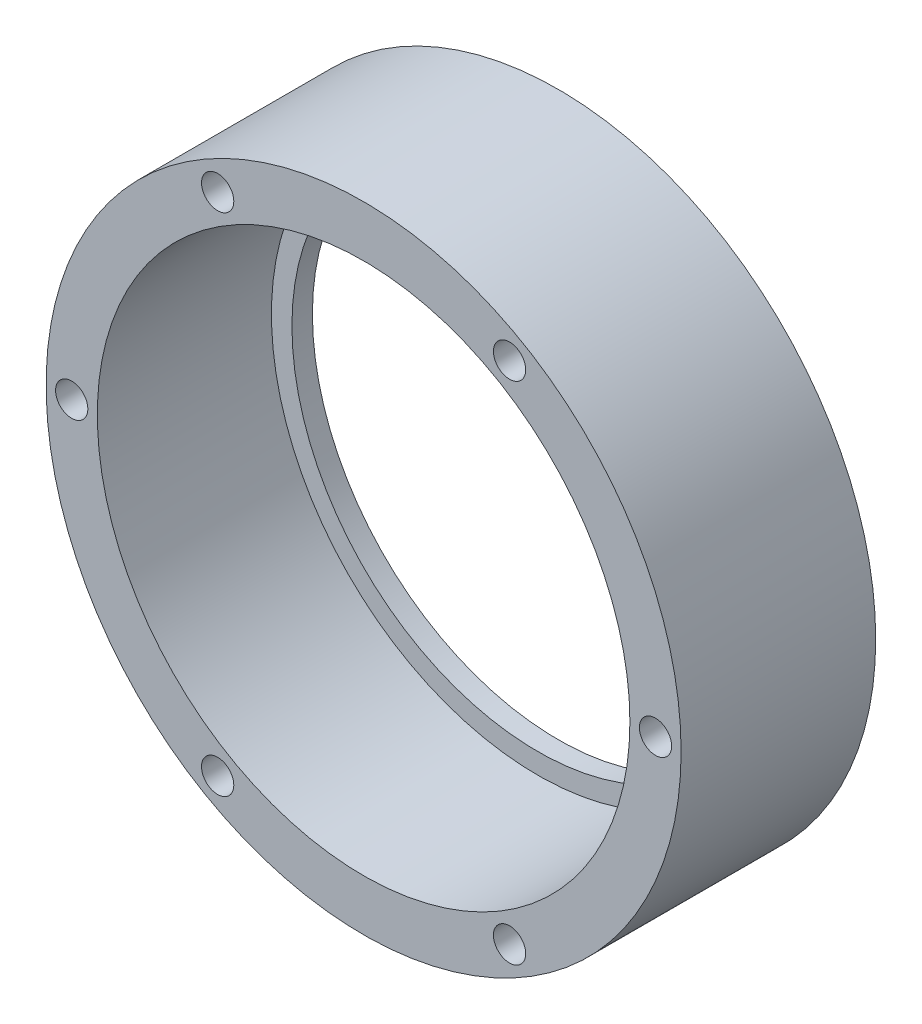
ISO-10303-21;
HEADER;
FILE_DESCRIPTION(('STEP AP214'),'2;1');
FILE_NAME('part.step','',(''),(''),'','','');
FILE_SCHEMA(('AUTOMOTIVE_DESIGN { 1 0 10303 214 1 1 1 1 }'));
ENDSEC;
DATA;
#1=APPLICATION_CONTEXT('core data for automotive mechanical design processes');
#2=APPLICATION_PROTOCOL_DEFINITION('international standard','automotive_design',2000,#1);
#3=PRODUCT_CONTEXT('',#1,'mechanical');
#4=PRODUCT('Part','Part','',(#3));
#5=PRODUCT_RELATED_PRODUCT_CATEGORY('part','',(#4));
#6=PRODUCT_DEFINITION_FORMATION('','',#4);
#7=PRODUCT_DEFINITION_CONTEXT('part definition',#1,'design');
#8=PRODUCT_DEFINITION('design','',#6,#7);
#9=PRODUCT_DEFINITION_SHAPE('','',#8);
#10=(LENGTH_UNIT() NAMED_UNIT(*) SI_UNIT(.MILLI.,.METRE.));
#11=(NAMED_UNIT(*) PLANE_ANGLE_UNIT() SI_UNIT($,.RADIAN.));
#12=(NAMED_UNIT(*) SI_UNIT($,.STERADIAN.) SOLID_ANGLE_UNIT());
#13=UNCERTAINTY_MEASURE_WITH_UNIT(LENGTH_MEASURE(1.E-05),#10,'distance_accuracy_value','');
#14=(GEOMETRIC_REPRESENTATION_CONTEXT(3) GLOBAL_UNCERTAINTY_ASSIGNED_CONTEXT((#13)) GLOBAL_UNIT_ASSIGNED_CONTEXT((#10,
#11,#12)) REPRESENTATION_CONTEXT('',''));
#15=CARTESIAN_POINT('',(0.,0.,0.));
#16=DIRECTION('',(0.,0.,1.));
#17=DIRECTION('',(1.,0.,0.));
#18=AXIS2_PLACEMENT_3D('',#15,#16,#17);
#19=CARTESIAN_POINT('',(0.,31.,-19.));
#20=DIRECTION('',(0.,0.,1.));
#21=DIRECTION('',(1.,0.,0.));
#22=AXIS2_PLACEMENT_3D('',#19,#20,#21);
#23=PLANE('',#22);
#24=CARTESIAN_POINT('',(0.,0.,-19.));
#25=DIRECTION('',(0.,0.,1.));
#26=DIRECTION('',(1.,0.,0.));
#27=AXIS2_PLACEMENT_3D('',#24,#25,#26);
#28=CIRCLE('',#27,31.);
#29=CARTESIAN_POINT('',(31.,0.,-19.));
#30=VERTEX_POINT('',#29);
#31=EDGE_CURVE('E106',#30,#30,#28,.T.);
#32=ORIENTED_EDGE('',*,*,#31,.F.);
#33=EDGE_LOOP('',(#32));
#34=FACE_BOUND('',#33,.T.);
#35=CARTESIAN_POINT('',(0.,0.,-19.));
#36=DIRECTION('',(0.,0.,1.));
#37=DIRECTION('',(1.,0.,0.));
#38=AXIS2_PLACEMENT_3D('',#35,#36,#37);
#39=CIRCLE('',#38,24.);
#40=CARTESIAN_POINT('',(24.,0.,-19.));
#41=VERTEX_POINT('',#40);
#42=EDGE_CURVE('E11',#41,#41,#39,.T.);
#43=ORIENTED_EDGE('',*,*,#42,.T.);
#44=EDGE_LOOP('',(#43));
#45=FACE_BOUND('',#44,.T.);
#46=ADVANCED_FACE('F35',(#34,#45),#23,.F.);
#47=CARTESIAN_POINT('',(0.,0.,0.));
#48=DIRECTION('',(0.,0.,1.));
#49=DIRECTION('',(1.,0.,0.));
#50=AXIS2_PLACEMENT_3D('',#47,#48,#49);
#51=CYLINDRICAL_SURFACE('',#50,24.);
#52=ORIENTED_EDGE('',*,*,#42,.F.);
#53=EDGE_LOOP('',(#52));
#54=FACE_BOUND('',#53,.T.);
#55=CARTESIAN_POINT('',(0.,0.,-17.));
#56=DIRECTION('',(0.,0.,1.));
#57=DIRECTION('',(1.,0.,0.));
#58=AXIS2_PLACEMENT_3D('',#55,#56,#57);
#59=CIRCLE('',#58,24.);
#60=CARTESIAN_POINT('',(24.,0.,-17.));
#61=VERTEX_POINT('',#60);
#62=EDGE_CURVE('E42',#61,#61,#59,.T.);
#63=ORIENTED_EDGE('',*,*,#62,.T.);
#64=EDGE_LOOP('',(#63));
#65=FACE_BOUND('',#64,.T.);
#66=ADVANCED_FACE('F120',(#54,#65),#51,.F.);
#67=CARTESIAN_POINT('',(0.,24.,-17.));
#68=DIRECTION('',(0.,0.,-1.));
#69=DIRECTION('',(-1.,0.,0.));
#70=AXIS2_PLACEMENT_3D('',#67,#68,#69);
#71=PLANE('',#70);
#72=ORIENTED_EDGE('',*,*,#62,.F.);
#73=EDGE_LOOP('',(#72));
#74=FACE_BOUND('',#73,.T.);
#75=CARTESIAN_POINT('',(0.,0.,-17.));
#76=DIRECTION('',(0.,0.,1.));
#77=DIRECTION('',(1.,0.,0.));
#78=AXIS2_PLACEMENT_3D('',#75,#76,#77);
#79=CIRCLE('',#78,26.);
#80=CARTESIAN_POINT('',(26.,0.,-17.));
#81=VERTEX_POINT('',#80);
#82=EDGE_CURVE('E115',#81,#81,#79,.T.);
#83=ORIENTED_EDGE('',*,*,#82,.T.);
#84=EDGE_LOOP('',(#83));
#85=FACE_BOUND('',#84,.T.);
#86=ADVANCED_FACE('F122',(#74,#85),#71,.F.);
#87=CARTESIAN_POINT('',(0.,0.,0.));
#88=DIRECTION('',(0.,0.,1.));
#89=DIRECTION('',(1.,0.,0.));
#90=AXIS2_PLACEMENT_3D('',#87,#88,#89);
#91=CYLINDRICAL_SURFACE('',#90,26.);
#92=ORIENTED_EDGE('',*,*,#82,.F.);
#93=EDGE_LOOP('',(#92));
#94=FACE_BOUND('',#93,.T.);
#95=CARTESIAN_POINT('',(0.,0.,0.));
#96=DIRECTION('',(0.,0.,1.));
#97=DIRECTION('',(1.,0.,0.));
#98=AXIS2_PLACEMENT_3D('',#95,#96,#97);
#99=CIRCLE('',#98,26.);
#100=CARTESIAN_POINT('',(26.,0.,0.));
#101=VERTEX_POINT('',#100);
#102=EDGE_CURVE('E112',#101,#101,#99,.T.);
#103=ORIENTED_EDGE('',*,*,#102,.T.);
#104=EDGE_LOOP('',(#103));
#105=FACE_BOUND('',#104,.T.);
#106=ADVANCED_FACE('F125',(#94,#105),#91,.F.);
#107=CARTESIAN_POINT('',(0.,26.,0.));
#108=DIRECTION('',(0.,0.,-1.));
#109=DIRECTION('',(-1.,0.,0.));
#110=AXIS2_PLACEMENT_3D('',#107,#108,#109);
#111=PLANE('',#110);
#112=CARTESIAN_POINT('',(14.2500000000003,-24.6817240078563,0.));
#113=DIRECTION('',(0.,0.,1.));
#114=DIRECTION('',(1.,0.,0.));
#115=AXIS2_PLACEMENT_3D('',#112,#113,#114);
#116=CIRCLE('',#115,1.57499999999999);
#117=CARTESIAN_POINT('',(15.8250000000003,-24.6817240078563,0.));
#118=VERTEX_POINT('',#117);
#119=EDGE_CURVE('E72',#118,#118,#116,.T.);
#120=ORIENTED_EDGE('',*,*,#119,.F.);
#121=EDGE_LOOP('',(#120));
#122=FACE_BOUND('',#121,.T.);
#123=CARTESIAN_POINT('',(-14.2499999999998,-24.6817240078566,0.));
#124=DIRECTION('',(0.,0.,1.));
#125=DIRECTION('',(1.,0.,0.));
#126=AXIS2_PLACEMENT_3D('',#123,#124,#125);
#127=CIRCLE('',#126,1.57499999999999);
#128=CARTESIAN_POINT('',(-12.6749999999998,-24.6817240078566,0.));
#129=VERTEX_POINT('',#128);
#130=EDGE_CURVE('E71',#129,#129,#127,.T.);
#131=ORIENTED_EDGE('',*,*,#130,.F.);
#132=EDGE_LOOP('',(#131));
#133=FACE_BOUND('',#132,.T.);
#134=CARTESIAN_POINT('',(-28.5,0.,0.));
#135=DIRECTION('',(0.,0.,1.));
#136=DIRECTION('',(1.,0.,0.));
#137=AXIS2_PLACEMENT_3D('',#134,#135,#136);
#138=CIRCLE('',#137,1.57499999999999);
#139=CARTESIAN_POINT('',(-26.925,0.,0.));
#140=VERTEX_POINT('',#139);
#141=EDGE_CURVE('E82',#140,#140,#138,.T.);
#142=ORIENTED_EDGE('',*,*,#141,.F.);
#143=EDGE_LOOP('',(#142));
#144=FACE_BOUND('',#143,.T.);
#145=CARTESIAN_POINT('',(-14.2500000000001,24.6817240078564,0.));
#146=DIRECTION('',(0.,0.,1.));
#147=DIRECTION('',(1.,0.,0.));
#148=AXIS2_PLACEMENT_3D('',#145,#146,#147);
#149=CIRCLE('',#148,1.57499999999999);
#150=CARTESIAN_POINT('',(-12.6750000000001,24.6817240078564,0.));
#151=VERTEX_POINT('',#150);
#152=EDGE_CURVE('E88',#151,#151,#149,.T.);
#153=ORIENTED_EDGE('',*,*,#152,.F.);
#154=EDGE_LOOP('',(#153));
#155=FACE_BOUND('',#154,.T.);
#156=CARTESIAN_POINT('',(14.2499999999999,24.6817240078565,0.));
#157=DIRECTION('',(0.,0.,1.));
#158=DIRECTION('',(1.,0.,0.));
#159=AXIS2_PLACEMENT_3D('',#156,#157,#158);
#160=CIRCLE('',#159,1.57499999999999);
#161=CARTESIAN_POINT('',(15.8249999999999,24.6817240078565,0.));
#162=VERTEX_POINT('',#161);
#163=EDGE_CURVE('E94',#162,#162,#160,.T.);
#164=ORIENTED_EDGE('',*,*,#163,.F.);
#165=EDGE_LOOP('',(#164));
#166=FACE_BOUND('',#165,.T.);
#167=CARTESIAN_POINT('',(28.5,0.,0.));
#168=DIRECTION('',(0.,0.,1.));
#169=DIRECTION('',(1.,0.,0.));
#170=AXIS2_PLACEMENT_3D('',#167,#168,#169);
#171=CIRCLE('',#170,1.57499999999999);
#172=CARTESIAN_POINT('',(30.075,0.,0.));
#173=VERTEX_POINT('',#172);
#174=EDGE_CURVE('E100',#173,#173,#171,.T.);
#175=ORIENTED_EDGE('',*,*,#174,.F.);
#176=EDGE_LOOP('',(#175));
#177=FACE_BOUND('',#176,.T.);
#178=ORIENTED_EDGE('',*,*,#102,.F.);
#179=EDGE_LOOP('',(#178));
#180=FACE_BOUND('',#179,.T.);
#181=CARTESIAN_POINT('',(0.,0.,0.));
#182=DIRECTION('',(0.,0.,1.));
#183=DIRECTION('',(1.,0.,0.));
#184=AXIS2_PLACEMENT_3D('',#181,#182,#183);
#185=CIRCLE('',#184,31.);
#186=CARTESIAN_POINT('',(31.,0.,0.));
#187=VERTEX_POINT('',#186);
#188=EDGE_CURVE('E109',#187,#187,#185,.T.);
#189=ORIENTED_EDGE('',*,*,#188,.T.);
#190=EDGE_LOOP('',(#189));
#191=FACE_BOUND('',#190,.T.);
#192=ADVANCED_FACE('F131',(#122,#133,#144,#155,#166,#177,#180,#191),#111,.F.);
#193=CARTESIAN_POINT('',(0.,0.,0.));
#194=DIRECTION('',(0.,0.,1.));
#195=DIRECTION('',(1.,0.,0.));
#196=AXIS2_PLACEMENT_3D('',#193,#194,#195);
#197=CYLINDRICAL_SURFACE('',#196,31.);
#198=ORIENTED_EDGE('',*,*,#188,.F.);
#199=EDGE_LOOP('',(#198));
#200=FACE_BOUND('',#199,.T.);
#201=ORIENTED_EDGE('',*,*,#31,.T.);
#202=EDGE_LOOP('',(#201));
#203=FACE_BOUND('',#202,.T.);
#204=ADVANCED_FACE('F137',(#200,#203),#197,.T.);
#205=CARTESIAN_POINT('',(28.5,0.,-7.99999999999999));
#206=DIRECTION('',(0.,0.,1.));
#207=DIRECTION('',(1.,0.,0.));
#208=AXIS2_PLACEMENT_3D('',#205,#206,#207);
#209=CONICAL_SURFACE('',#208,1.57499999999999,1.02974425867665);
#210=CARTESIAN_POINT('',(28.5,0.,-8.94635547496841));
#211=VERTEX_POINT('',#210);
#212=VERTEX_LOOP('',#211);
#213=FACE_BOUND('',#212,.T.);
#214=CARTESIAN_POINT('',(28.5,0.,-7.99999999999999));
#215=DIRECTION('',(0.,0.,1.));
#216=DIRECTION('',(1.,0.,0.));
#217=AXIS2_PLACEMENT_3D('',#214,#215,#216);
#218=CIRCLE('',#217,1.57499999999999);
#219=CARTESIAN_POINT('',(30.075,0.,-7.99999999999999));
#220=VERTEX_POINT('',#219);
#221=EDGE_CURVE('E103',#220,#220,#218,.T.);
#222=ORIENTED_EDGE('',*,*,#221,.T.);
#223=EDGE_LOOP('',(#222));
#224=FACE_BOUND('',#223,.T.);
#225=ADVANCED_FACE('F144',(#213,#224),#209,.F.);
#226=CARTESIAN_POINT('',(28.5,0.,0.));
#227=DIRECTION('',(0.,0.,1.));
#228=DIRECTION('',(1.,0.,0.));
#229=AXIS2_PLACEMENT_3D('',#226,#227,#228);
#230=CYLINDRICAL_SURFACE('',#229,1.57499999999999);
#231=ORIENTED_EDGE('',*,*,#221,.F.);
#232=EDGE_LOOP('',(#231));
#233=FACE_BOUND('',#232,.T.);
#234=ORIENTED_EDGE('',*,*,#174,.T.);
#235=EDGE_LOOP('',(#234));
#236=FACE_BOUND('',#235,.T.);
#237=ADVANCED_FACE('F158',(#233,#236),#230,.F.);
#238=CARTESIAN_POINT('',(14.2499999999999,24.6817240078565,-7.99999999999999));
#239=DIRECTION('',(0.,0.,1.));
#240=DIRECTION('',(1.,0.,0.));
#241=AXIS2_PLACEMENT_3D('',#238,#239,#240);
#242=CONICAL_SURFACE('',#241,1.57499999999999,1.02974425867665);
#243=CARTESIAN_POINT('',(14.2499999999999,24.6817240078565,-8.94635547496841));
#244=VERTEX_POINT('',#243);
#245=VERTEX_LOOP('',#244);
#246=FACE_BOUND('',#245,.T.);
#247=CARTESIAN_POINT('',(14.2499999999999,24.6817240078565,-7.99999999999999));
#248=DIRECTION('',(0.,0.,1.));
#249=DIRECTION('',(1.,0.,0.));
#250=AXIS2_PLACEMENT_3D('',#247,#248,#249);
#251=CIRCLE('',#250,1.57499999999999);
#252=CARTESIAN_POINT('',(15.8249999999999,24.6817240078565,-7.99999999999999));
#253=VERTEX_POINT('',#252);
#254=EDGE_CURVE('E97',#253,#253,#251,.T.);
#255=ORIENTED_EDGE('',*,*,#254,.T.);
#256=EDGE_LOOP('',(#255));
#257=FACE_BOUND('',#256,.T.);
#258=ADVANCED_FACE('F161',(#246,#257),#242,.F.);
#259=CARTESIAN_POINT('',(14.2499999999999,24.6817240078565,0.));
#260=DIRECTION('',(0.,0.,1.));
#261=DIRECTION('',(1.,0.,0.));
#262=AXIS2_PLACEMENT_3D('',#259,#260,#261);
#263=CYLINDRICAL_SURFACE('',#262,1.57499999999999);
#264=ORIENTED_EDGE('',*,*,#254,.F.);
#265=EDGE_LOOP('',(#264));
#266=FACE_BOUND('',#265,.T.);
#267=ORIENTED_EDGE('',*,*,#163,.T.);
#268=EDGE_LOOP('',(#267));
#269=FACE_BOUND('',#268,.T.);
#270=ADVANCED_FACE('F165',(#266,#269),#263,.F.);
#271=CARTESIAN_POINT('',(-14.2500000000001,24.6817240078564,-7.99999999999999));
#272=DIRECTION('',(0.,0.,1.));
#273=DIRECTION('',(1.,0.,0.));
#274=AXIS2_PLACEMENT_3D('',#271,#272,#273);
#275=CONICAL_SURFACE('',#274,1.57499999999999,1.02974425867665);
#276=CARTESIAN_POINT('',(-14.2500000000001,24.6817240078564,-8.94635547496841));
#277=VERTEX_POINT('',#276);
#278=VERTEX_LOOP('',#277);
#279=FACE_BOUND('',#278,.T.);
#280=CARTESIAN_POINT('',(-14.2500000000001,24.6817240078564,-7.99999999999999));
#281=DIRECTION('',(0.,0.,1.));
#282=DIRECTION('',(1.,0.,0.));
#283=AXIS2_PLACEMENT_3D('',#280,#281,#282);
#284=CIRCLE('',#283,1.57499999999999);
#285=CARTESIAN_POINT('',(-12.6750000000001,24.6817240078564,-7.99999999999999));
#286=VERTEX_POINT('',#285);
#287=EDGE_CURVE('E91',#286,#286,#284,.T.);
#288=ORIENTED_EDGE('',*,*,#287,.T.);
#289=EDGE_LOOP('',(#288));
#290=FACE_BOUND('',#289,.T.);
#291=ADVANCED_FACE('F168',(#279,#290),#275,.F.);
#292=CARTESIAN_POINT('',(-14.2500000000001,24.6817240078564,0.));
#293=DIRECTION('',(0.,0.,1.));
#294=DIRECTION('',(1.,0.,0.));
#295=AXIS2_PLACEMENT_3D('',#292,#293,#294);
#296=CYLINDRICAL_SURFACE('',#295,1.57499999999999);
#297=ORIENTED_EDGE('',*,*,#287,.F.);
#298=EDGE_LOOP('',(#297));
#299=FACE_BOUND('',#298,.T.);
#300=ORIENTED_EDGE('',*,*,#152,.T.);
#301=EDGE_LOOP('',(#300));
#302=FACE_BOUND('',#301,.T.);
#303=ADVANCED_FACE('F172',(#299,#302),#296,.F.);
#304=CARTESIAN_POINT('',(-28.5,0.,-7.99999999999999));
#305=DIRECTION('',(0.,0.,1.));
#306=DIRECTION('',(1.,0.,0.));
#307=AXIS2_PLACEMENT_3D('',#304,#305,#306);
#308=CONICAL_SURFACE('',#307,1.57499999999999,1.02974425867665);
#309=CARTESIAN_POINT('',(-28.5,0.,-8.94635547496841));
#310=VERTEX_POINT('',#309);
#311=VERTEX_LOOP('',#310);
#312=FACE_BOUND('',#311,.T.);
#313=CARTESIAN_POINT('',(-28.5,0.,-7.99999999999999));
#314=DIRECTION('',(0.,0.,1.));
#315=DIRECTION('',(1.,0.,0.));
#316=AXIS2_PLACEMENT_3D('',#313,#314,#315);
#317=CIRCLE('',#316,1.57499999999999);
#318=CARTESIAN_POINT('',(-26.925,0.,-7.99999999999999));
#319=VERTEX_POINT('',#318);
#320=EDGE_CURVE('E85',#319,#319,#317,.T.);
#321=ORIENTED_EDGE('',*,*,#320,.T.);
#322=EDGE_LOOP('',(#321));
#323=FACE_BOUND('',#322,.T.);
#324=ADVANCED_FACE('F176',(#312,#323),#308,.F.);
#325=CARTESIAN_POINT('',(-28.5,0.,0.));
#326=DIRECTION('',(0.,0.,1.));
#327=DIRECTION('',(1.,0.,0.));
#328=AXIS2_PLACEMENT_3D('',#325,#326,#327);
#329=CYLINDRICAL_SURFACE('',#328,1.57499999999999);
#330=ORIENTED_EDGE('',*,*,#320,.F.);
#331=EDGE_LOOP('',(#330));
#332=FACE_BOUND('',#331,.T.);
#333=ORIENTED_EDGE('',*,*,#141,.T.);
#334=EDGE_LOOP('',(#333));
#335=FACE_BOUND('',#334,.T.);
#336=ADVANCED_FACE('F180',(#332,#335),#329,.F.);
#337=CARTESIAN_POINT('',(-14.2499999999998,-24.6817240078566,-7.99999999999999));
#338=DIRECTION('',(0.,0.,1.));
#339=DIRECTION('',(1.,0.,0.));
#340=AXIS2_PLACEMENT_3D('',#337,#338,#339);
#341=CONICAL_SURFACE('',#340,1.57499999999999,1.02974425867665);
#342=CARTESIAN_POINT('',(-14.2499999999998,-24.6817240078566,-8.94635547496841));
#343=VERTEX_POINT('',#342);
#344=VERTEX_LOOP('',#343);
#345=FACE_BOUND('',#344,.T.);
#346=CARTESIAN_POINT('',(-14.2499999999998,-24.6817240078566,-7.99999999999999));
#347=DIRECTION('',(0.,0.,1.));
#348=DIRECTION('',(1.,0.,0.));
#349=AXIS2_PLACEMENT_3D('',#346,#347,#348);
#350=CIRCLE('',#349,1.57499999999999);
#351=CARTESIAN_POINT('',(-12.6749999999998,-24.6817240078566,-7.99999999999999));
#352=VERTEX_POINT('',#351);
#353=EDGE_CURVE('E75',#352,#352,#350,.T.);
#354=ORIENTED_EDGE('',*,*,#353,.T.);
#355=EDGE_LOOP('',(#354));
#356=FACE_BOUND('',#355,.T.);
#357=ADVANCED_FACE('F184',(#345,#356),#341,.F.);
#358=CARTESIAN_POINT('',(-14.2499999999998,-24.6817240078566,0.));
#359=DIRECTION('',(0.,0.,1.));
#360=DIRECTION('',(1.,0.,0.));
#361=AXIS2_PLACEMENT_3D('',#358,#359,#360);
#362=CYLINDRICAL_SURFACE('',#361,1.57499999999999);
#363=ORIENTED_EDGE('',*,*,#353,.F.);
#364=EDGE_LOOP('',(#363));
#365=FACE_BOUND('',#364,.T.);
#366=ORIENTED_EDGE('',*,*,#130,.T.);
#367=EDGE_LOOP('',(#366));
#368=FACE_BOUND('',#367,.T.);
#369=ADVANCED_FACE('F65',(#365,#368),#362,.F.);
#370=CARTESIAN_POINT('',(14.2500000000003,-24.6817240078563,-7.99999999999999));
#371=DIRECTION('',(0.,0.,1.));
#372=DIRECTION('',(1.,0.,0.));
#373=AXIS2_PLACEMENT_3D('',#370,#371,#372);
#374=CONICAL_SURFACE('',#373,1.57499999999999,1.02974425867665);
#375=CARTESIAN_POINT('',(14.2500000000003,-24.6817240078563,-8.94635547496841));
#376=VERTEX_POINT('',#375);
#377=VERTEX_LOOP('',#376);
#378=FACE_BOUND('',#377,.T.);
#379=CARTESIAN_POINT('',(14.2500000000003,-24.6817240078563,-7.99999999999999));
#380=DIRECTION('',(0.,0.,1.));
#381=DIRECTION('',(1.,0.,0.));
#382=AXIS2_PLACEMENT_3D('',#379,#380,#381);
#383=CIRCLE('',#382,1.57499999999999);
#384=CARTESIAN_POINT('',(15.8250000000003,-24.6817240078563,-7.99999999999999));
#385=VERTEX_POINT('',#384);
#386=EDGE_CURVE('E69',#385,#385,#383,.T.);
#387=ORIENTED_EDGE('',*,*,#386,.T.);
#388=EDGE_LOOP('',(#387));
#389=FACE_BOUND('',#388,.T.);
#390=ADVANCED_FACE('F61',(#378,#389),#374,.F.);
#391=CARTESIAN_POINT('',(14.2500000000003,-24.6817240078563,0.));
#392=DIRECTION('',(0.,0.,1.));
#393=DIRECTION('',(1.,0.,0.));
#394=AXIS2_PLACEMENT_3D('',#391,#392,#393);
#395=CYLINDRICAL_SURFACE('',#394,1.57499999999999);
#396=ORIENTED_EDGE('',*,*,#386,.F.);
#397=EDGE_LOOP('',(#396));
#398=FACE_BOUND('',#397,.T.);
#399=ORIENTED_EDGE('',*,*,#119,.T.);
#400=EDGE_LOOP('',(#399));
#401=FACE_BOUND('',#400,.T.);
#402=ADVANCED_FACE('F64',(#398,#401),#395,.F.);
#403=CLOSED_SHELL('',(#46,#66,#86,#106,#192,#204,#225,#237,#258,#270,#291,#303,#324,#336,#357,
#369,#390,#402));
#404=MANIFOLD_SOLID_BREP('B2',#403);
#405=ADVANCED_BREP_SHAPE_REPRESENTATION('',(#18,#404),#14);
#406=SHAPE_DEFINITION_REPRESENTATION(#9,#405);
ENDSEC;
END-ISO-10303-21;
